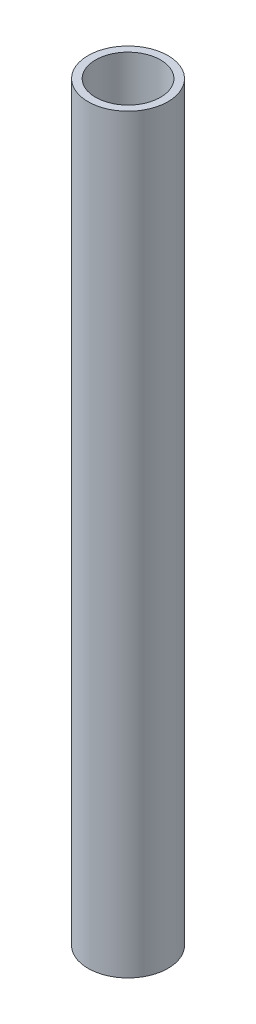
ISO-10303-21;
HEADER;
FILE_DESCRIPTION(('STEP AP214'),'2;1');
FILE_NAME('part.step','',(''),(''),'','','');
FILE_SCHEMA(('AUTOMOTIVE_DESIGN { 1 0 10303 214 1 1 1 1 }'));
ENDSEC;
DATA;
#1=APPLICATION_CONTEXT('core data for automotive mechanical design processes');
#2=APPLICATION_PROTOCOL_DEFINITION('international standard','automotive_design',2000,#1);
#3=PRODUCT_CONTEXT('',#1,'mechanical');
#4=PRODUCT('Part','Part','',(#3));
#5=PRODUCT_RELATED_PRODUCT_CATEGORY('part','',(#4));
#6=PRODUCT_DEFINITION_FORMATION('','',#4);
#7=PRODUCT_DEFINITION_CONTEXT('part definition',#1,'design');
#8=PRODUCT_DEFINITION('design','',#6,#7);
#9=PRODUCT_DEFINITION_SHAPE('','',#8);
#10=(LENGTH_UNIT() NAMED_UNIT(*) SI_UNIT(.MILLI.,.METRE.));
#11=(NAMED_UNIT(*) PLANE_ANGLE_UNIT() SI_UNIT($,.RADIAN.));
#12=(NAMED_UNIT(*) SI_UNIT($,.STERADIAN.) SOLID_ANGLE_UNIT());
#13=UNCERTAINTY_MEASURE_WITH_UNIT(LENGTH_MEASURE(1.E-05),#10,'distance_accuracy_value','');
#14=(GEOMETRIC_REPRESENTATION_CONTEXT(3) GLOBAL_UNCERTAINTY_ASSIGNED_CONTEXT((#13)) GLOBAL_UNIT_ASSIGNED_CONTEXT((#10,
#11,#12)) REPRESENTATION_CONTEXT('',''));
#15=CARTESIAN_POINT('',(0.,0.,0.));
#16=DIRECTION('',(0.,0.,1.));
#17=DIRECTION('',(1.,0.,0.));
#18=AXIS2_PLACEMENT_3D('',#15,#16,#17);
#19=CARTESIAN_POINT('',(2.44769482460327E-11,200.000000000001,1.5000000000002));
#20=DIRECTION('',(0.,1.,0.));
#21=DIRECTION('',(0.,0.,1.));
#22=AXIS2_PLACEMENT_3D('',#19,#20,#21);
#23=PLANE('',#22);
#24=CARTESIAN_POINT('',(2.44769482460327E-11,200.000000000001,1.5000000000002));
#25=DIRECTION('',(0.,1.,0.));
#26=DIRECTION('',(0.,0.,1.));
#27=AXIS2_PLACEMENT_3D('',#24,#25,#26);
#28=CIRCLE('',#27,10.65);
#29=CARTESIAN_POINT('',(2.44151500232522E-11,200.000000000001,-9.1499999999998));
#30=VERTEX_POINT('',#29);
#31=EDGE_CURVE('E12',#30,#30,#28,.T.);
#32=ORIENTED_EDGE('',*,*,#31,.T.);
#33=EDGE_LOOP('',(#32));
#34=FACE_BOUND('',#33,.T.);
#35=CARTESIAN_POINT('',(2.44769482460327E-11,200.000000000001,1.5000000000002));
#36=DIRECTION('',(0.,1.,0.));
#37=DIRECTION('',(0.,0.,1.));
#38=AXIS2_PLACEMENT_3D('',#35,#36,#37);
#39=CIRCLE('',#38,8.65);
#40=CARTESIAN_POINT('',(2.44267553233049E-11,200.000000000001,-7.1499999999998));
#41=VERTEX_POINT('',#40);
#42=EDGE_CURVE('E60',#41,#41,#39,.T.);
#43=ORIENTED_EDGE('',*,*,#42,.F.);
#44=EDGE_LOOP('',(#43));
#45=FACE_BOUND('',#44,.T.);
#46=ADVANCED_FACE('F46',(#34,#45),#23,.T.);
#47=CARTESIAN_POINT('',(2.45532760789757E-11,0.,1.5000000000005));
#48=DIRECTION('',(0.,1.,0.));
#49=DIRECTION('',(0.,0.,1.));
#50=AXIS2_PLACEMENT_3D('',#47,#48,#49);
#51=PLANE('',#50);
#52=CARTESIAN_POINT('',(2.45532760789757E-11,0.,1.5000000000005));
#53=DIRECTION('',(0.,1.,0.));
#54=DIRECTION('',(0.,0.,1.));
#55=AXIS2_PLACEMENT_3D('',#52,#53,#54);
#56=CIRCLE('',#55,10.65);
#57=CARTESIAN_POINT('',(2.4271393031569E-11,0.,-9.14999999999974));
#58=VERTEX_POINT('',#57);
#59=EDGE_CURVE('E50',#58,#58,#56,.T.);
#60=ORIENTED_EDGE('',*,*,#59,.F.);
#61=EDGE_LOOP('',(#60));
#62=FACE_BOUND('',#61,.T.);
#63=CARTESIAN_POINT('',(2.45532760789757E-11,0.,1.5000000000005));
#64=DIRECTION('',(0.,1.,0.));
#65=DIRECTION('',(0.,0.,1.));
#66=AXIS2_PLACEMENT_3D('',#63,#64,#65);
#67=CIRCLE('',#66,8.65);
#68=CARTESIAN_POINT('',(2.42829983316217E-11,0.,-7.14999999999975));
#69=VERTEX_POINT('',#68);
#70=EDGE_CURVE('E62',#69,#69,#67,.T.);
#71=ORIENTED_EDGE('',*,*,#70,.T.);
#72=EDGE_LOOP('',(#71));
#73=FACE_BOUND('',#72,.T.);
#74=ADVANCED_FACE('F75',(#62,#73),#51,.F.);
#75=CARTESIAN_POINT('',(2.44769482460327E-11,200.000000000001,1.5000000000002));
#76=DIRECTION('',(0.,-1.,0.));
#77=DIRECTION('',(0.,0.,-1.));
#78=AXIS2_PLACEMENT_3D('',#75,#76,#77);
#79=CYLINDRICAL_SURFACE('',#78,10.65);
#80=CARTESIAN_POINT('',(2.44151500232522E-11,200.000000000001,-9.1499999999998));
#81=CARTESIAN_POINT('',(2.44136525545888E-11,197.916666666667,-9.1499999999998));
#82=CARTESIAN_POINT('',(2.44121550859255E-11,195.833333333334,-9.1499999999998));
#83=CARTESIAN_POINT('',(2.44091601485987E-11,191.666666666667,-9.1499999999998));
#84=CARTESIAN_POINT('',(2.44076626799354E-11,189.583333333334,-9.1499999999998));
#85=CARTESIAN_POINT('',(2.44046677426086E-11,185.416666666667,-9.1499999999998));
#86=CARTESIAN_POINT('',(2.44031702739453E-11,183.333333333334,-9.1499999999998));
#87=CARTESIAN_POINT('',(2.44001753366185E-11,179.166666666667,-9.1499999999998));
#88=CARTESIAN_POINT('',(2.43986778679552E-11,177.083333333334,-9.14999999999979));
#89=CARTESIAN_POINT('',(2.43956829306284E-11,172.916666666667,-9.14999999999979));
#90=CARTESIAN_POINT('',(2.43941854619651E-11,170.833333333334,-9.14999999999979));
#91=CARTESIAN_POINT('',(2.43911905246383E-11,166.666666666667,-9.14999999999979));
#92=CARTESIAN_POINT('',(2.4389693055975E-11,164.583333333334,-9.14999999999979));
#93=CARTESIAN_POINT('',(2.43866981186482E-11,160.416666666667,-9.14999999999979));
#94=CARTESIAN_POINT('',(2.43852006499849E-11,158.333333333334,-9.14999999999979));
#95=CARTESIAN_POINT('',(2.43822057126581E-11,154.166666666667,-9.14999999999979));
#96=CARTESIAN_POINT('',(2.43807082439948E-11,152.083333333334,-9.14999999999979));
#97=CARTESIAN_POINT('',(2.4377713306668E-11,147.916666666667,-9.14999999999979));
#98=CARTESIAN_POINT('',(2.43762158380047E-11,145.833333333334,-9.14999999999979));
#99=CARTESIAN_POINT('',(2.43732209006779E-11,141.666666666667,-9.14999999999979));
#100=CARTESIAN_POINT('',(2.43717234320146E-11,139.583333333334,-9.14999999999978));
#101=CARTESIAN_POINT('',(2.43687284946878E-11,135.416666666667,-9.14999999999978));
#102=CARTESIAN_POINT('',(2.43672310260245E-11,133.333333333334,-9.14999999999978));
#103=CARTESIAN_POINT('',(2.43642360886977E-11,129.166666666667,-9.14999999999978));
#104=CARTESIAN_POINT('',(2.43627386200344E-11,127.083333333334,-9.14999999999978));
#105=CARTESIAN_POINT('',(2.43597436827076E-11,122.916666666667,-9.14999999999978));
#106=CARTESIAN_POINT('',(2.43582462140443E-11,120.833333333334,-9.14999999999978));
#107=CARTESIAN_POINT('',(2.43552512767175E-11,116.666666666667,-9.14999999999978));
#108=CARTESIAN_POINT('',(2.43537538080542E-11,114.583333333334,-9.14999999999978));
#109=CARTESIAN_POINT('',(2.43507588707274E-11,110.416666666667,-9.14999999999978));
#110=CARTESIAN_POINT('',(2.43492614020641E-11,108.333333333334,-9.14999999999977));
#111=CARTESIAN_POINT('',(2.43462664647373E-11,104.166666666667,-9.14999999999977));
#112=CARTESIAN_POINT('',(2.4344768996074E-11,102.083333333334,-9.14999999999977));
#113=CARTESIAN_POINT('',(2.43417740587472E-11,97.916666666667,-9.14999999999977));
#114=CARTESIAN_POINT('',(2.43402765900839E-11,95.8333333333336,-9.14999999999977));
#115=CARTESIAN_POINT('',(2.43372816527571E-11,91.666666666667,-9.14999999999977));
#116=CARTESIAN_POINT('',(2.43357841840938E-11,89.5833333333336,-9.14999999999977));
#117=CARTESIAN_POINT('',(2.4332789246767E-11,85.4166666666669,-9.14999999999977));
#118=CARTESIAN_POINT('',(2.43312917781037E-11,83.3333333333336,-9.14999999999977));
#119=CARTESIAN_POINT('',(2.43282968407769E-11,79.1666666666669,-9.14999999999977));
#120=CARTESIAN_POINT('',(2.43267993721136E-11,77.0833333333336,-9.14999999999977));
#121=CARTESIAN_POINT('',(2.43238044347868E-11,72.9166666666669,-9.14999999999977));
#122=CARTESIAN_POINT('',(2.43223069661235E-11,70.8333333333336,-9.14999999999976));
#123=CARTESIAN_POINT('',(2.43193120287967E-11,66.6666666666669,-9.14999999999976));
#124=CARTESIAN_POINT('',(2.43178145601334E-11,64.5833333333336,-9.14999999999976));
#125=CARTESIAN_POINT('',(2.43148196228066E-11,60.4166666666669,-9.14999999999976));
#126=CARTESIAN_POINT('',(2.43133221541433E-11,58.3333333333336,-9.14999999999976));
#127=CARTESIAN_POINT('',(2.43103272168165E-11,54.1666666666669,-9.14999999999976));
#128=CARTESIAN_POINT('',(2.43088297481532E-11,52.0833333333335,-9.14999999999976));
#129=CARTESIAN_POINT('',(2.43058348108264E-11,47.9166666666669,-9.14999999999976));
#130=CARTESIAN_POINT('',(2.43043373421631E-11,45.8333333333335,-9.14999999999976));
#131=CARTESIAN_POINT('',(2.43013424048363E-11,41.6666666666669,-9.14999999999976));
#132=CARTESIAN_POINT('',(2.4299844936173E-11,39.5833333333335,-9.14999999999976));
#133=CARTESIAN_POINT('',(2.42968499988462E-11,35.4166666666668,-9.14999999999976));
#134=CARTESIAN_POINT('',(2.42953525301829E-11,33.3333333333335,-9.14999999999975));
#135=CARTESIAN_POINT('',(2.42923575928561E-11,29.1666666666668,-9.14999999999975));
#136=CARTESIAN_POINT('',(2.42908601241928E-11,27.0833333333335,-9.14999999999975));
#137=CARTESIAN_POINT('',(2.4287865186866E-11,22.9166666666668,-9.14999999999975));
#138=CARTESIAN_POINT('',(2.42863677182027E-11,20.8333333333335,-9.14999999999975));
#139=CARTESIAN_POINT('',(2.42833727808759E-11,16.6666666666668,-9.14999999999975));
#140=CARTESIAN_POINT('',(2.42818753122126E-11,14.5833333333335,-9.14999999999975));
#141=CARTESIAN_POINT('',(2.42788803748858E-11,10.4166666666668,-9.14999999999975));
#142=CARTESIAN_POINT('',(2.42773829062225E-11,8.33333333333343,-9.14999999999975));
#143=CARTESIAN_POINT('',(2.42743879688957E-11,4.16666666666675,-9.14999999999975));
#144=CARTESIAN_POINT('',(2.42728905002324E-11,2.08333333333342,-9.14999999999974));
#145=CARTESIAN_POINT('',(2.4271393031569E-11,0.,-9.14999999999974));
#146=B_SPLINE_CURVE_WITH_KNOTS('',3,(#80,#81,#82,#83,#84,#85,#86,#87,#88,#89,#90,#91,#92,#93,
#94,#95,#96,#97,#98,#99,#100,#101,#102,#103,#104,#105,#106,#107,#108,#109,#110,#111,#112,#113,
#114,#115,#116,#117,#118,#119,#120,#121,#122,#123,#124,#125,#126,#127,#128,#129,#130,#131,#132,
#133,#134,#135,#136,#137,#138,#139,#140,#141,#142,#143,#144,#145),.UNSPECIFIED.,.F.,.F.,(4,2,2,
2,2,2,2,2,2,2,2,2,2,2,2,2,2,2,2,2,2,2,2,2,2,2,2,2,2,2,2,2,4),(0.,6.25000000000003,12.5,18.75,
25.0000000000001,31.2500000000001,37.5000000000001,43.7500000000001,50.0000000000001,
56.2500000000001,62.5000000000001,68.7500000000002,75.0000000000002,81.2500000000002,
87.5000000000002,93.7500000000002,100.,106.25,112.5,118.75,125.,131.25,137.5,143.75,150.,156.25,
162.5,168.75,175.,181.25,187.5,193.75,200.),.UNSPECIFIED.);
#147=EDGE_CURVE('BSEAM48',#30,#58,#146,.T.);
#148=ORIENTED_EDGE('',*,*,#31,.F.);
#149=ORIENTED_EDGE('',*,*,#59,.T.);
#150=ORIENTED_EDGE('',*,*,#147,.T.);
#151=ORIENTED_EDGE('',*,*,#147,.F.);
#152=EDGE_LOOP('',(#148,#150,#149,#151));
#153=FACE_BOUND('',#152,.T.);
#154=ADVANCED_FACE('F48',(#153),#79,.T.);
#155=CARTESIAN_POINT('',(2.44769482460327E-11,200.000000000001,1.5000000000002));
#156=DIRECTION('',(0.,-1.,0.));
#157=DIRECTION('',(0.,0.,-1.));
#158=AXIS2_PLACEMENT_3D('',#155,#156,#157);
#159=CYLINDRICAL_SURFACE('',#158,8.65);
#160=CARTESIAN_POINT('',(2.44267553233049E-11,200.000000000001,-7.1499999999998));
#161=CARTESIAN_POINT('',(2.44252578546415E-11,197.916666666667,-7.1499999999998));
#162=CARTESIAN_POINT('',(2.44237603859782E-11,195.833333333334,-7.1499999999998));
#163=CARTESIAN_POINT('',(2.44207654486514E-11,191.666666666667,-7.1499999999998));
#164=CARTESIAN_POINT('',(2.44192679799881E-11,189.583333333334,-7.1499999999998));
#165=CARTESIAN_POINT('',(2.44162730426613E-11,185.416666666667,-7.1499999999998));
#166=CARTESIAN_POINT('',(2.4414775573998E-11,183.333333333334,-7.1499999999998));
#167=CARTESIAN_POINT('',(2.44117806366712E-11,179.166666666667,-7.1499999999998));
#168=CARTESIAN_POINT('',(2.44102831680079E-11,177.083333333334,-7.1499999999998));
#169=CARTESIAN_POINT('',(2.44072882306811E-11,172.916666666667,-7.14999999999979));
#170=CARTESIAN_POINT('',(2.44057907620178E-11,170.833333333334,-7.14999999999979));
#171=CARTESIAN_POINT('',(2.4402795824691E-11,166.666666666667,-7.14999999999979));
#172=CARTESIAN_POINT('',(2.44012983560277E-11,164.583333333334,-7.14999999999979));
#173=CARTESIAN_POINT('',(2.43983034187009E-11,160.416666666667,-7.14999999999979));
#174=CARTESIAN_POINT('',(2.43968059500376E-11,158.333333333334,-7.14999999999979));
#175=CARTESIAN_POINT('',(2.43938110127108E-11,154.166666666667,-7.14999999999979));
#176=CARTESIAN_POINT('',(2.43923135440475E-11,152.083333333334,-7.14999999999979));
#177=CARTESIAN_POINT('',(2.43893186067207E-11,147.916666666667,-7.14999999999979));
#178=CARTESIAN_POINT('',(2.43878211380574E-11,145.833333333334,-7.14999999999979));
#179=CARTESIAN_POINT('',(2.43848262007306E-11,141.666666666667,-7.14999999999979));
#180=CARTESIAN_POINT('',(2.43833287320673E-11,139.583333333334,-7.14999999999979));
#181=CARTESIAN_POINT('',(2.43803337947405E-11,135.416666666667,-7.14999999999978));
#182=CARTESIAN_POINT('',(2.43788363260772E-11,133.333333333334,-7.14999999999978));
#183=CARTESIAN_POINT('',(2.43758413887504E-11,129.166666666667,-7.14999999999978));
#184=CARTESIAN_POINT('',(2.43743439200871E-11,127.083333333334,-7.14999999999978));
#185=CARTESIAN_POINT('',(2.43713489827603E-11,122.916666666667,-7.14999999999978));
#186=CARTESIAN_POINT('',(2.4369851514097E-11,120.833333333334,-7.14999999999978));
#187=CARTESIAN_POINT('',(2.43668565767702E-11,116.666666666667,-7.14999999999978));
#188=CARTESIAN_POINT('',(2.43653591081069E-11,114.583333333334,-7.14999999999978));
#189=CARTESIAN_POINT('',(2.43623641707801E-11,110.416666666667,-7.14999999999978));
#190=CARTESIAN_POINT('',(2.43608667021168E-11,108.333333333334,-7.14999999999978));
#191=CARTESIAN_POINT('',(2.435787176479E-11,104.166666666667,-7.14999999999978));
#192=CARTESIAN_POINT('',(2.43563742961267E-11,102.083333333334,-7.14999999999978));
#193=CARTESIAN_POINT('',(2.43533793587999E-11,97.916666666667,-7.14999999999977));
#194=CARTESIAN_POINT('',(2.43518818901366E-11,95.8333333333336,-7.14999999999977));
#195=CARTESIAN_POINT('',(2.43488869528098E-11,91.666666666667,-7.14999999999977));
#196=CARTESIAN_POINT('',(2.43473894841465E-11,89.5833333333336,-7.14999999999977));
#197=CARTESIAN_POINT('',(2.43443945468197E-11,85.4166666666669,-7.14999999999977));
#198=CARTESIAN_POINT('',(2.43428970781564E-11,83.3333333333336,-7.14999999999977));
#199=CARTESIAN_POINT('',(2.43399021408296E-11,79.1666666666669,-7.14999999999977));
#200=CARTESIAN_POINT('',(2.43384046721663E-11,77.0833333333336,-7.14999999999977));
#201=CARTESIAN_POINT('',(2.43354097348395E-11,72.9166666666669,-7.14999999999977));
#202=CARTESIAN_POINT('',(2.43339122661762E-11,70.8333333333336,-7.14999999999977));
#203=CARTESIAN_POINT('',(2.43309173288494E-11,66.6666666666669,-7.14999999999976));
#204=CARTESIAN_POINT('',(2.43294198601861E-11,64.5833333333336,-7.14999999999976));
#205=CARTESIAN_POINT('',(2.43264249228593E-11,60.4166666666669,-7.14999999999976));
#206=CARTESIAN_POINT('',(2.4324927454196E-11,58.3333333333336,-7.14999999999976));
#207=CARTESIAN_POINT('',(2.43219325168692E-11,54.1666666666669,-7.14999999999976));
#208=CARTESIAN_POINT('',(2.43204350482059E-11,52.0833333333335,-7.14999999999976));
#209=CARTESIAN_POINT('',(2.43174401108791E-11,47.9166666666669,-7.14999999999976));
#210=CARTESIAN_POINT('',(2.43159426422158E-11,45.8333333333335,-7.14999999999976));
#211=CARTESIAN_POINT('',(2.4312947704889E-11,41.6666666666669,-7.14999999999976));
#212=CARTESIAN_POINT('',(2.43114502362257E-11,39.5833333333335,-7.14999999999976));
#213=CARTESIAN_POINT('',(2.43084552988989E-11,35.4166666666668,-7.14999999999976));
#214=CARTESIAN_POINT('',(2.43069578302356E-11,33.3333333333335,-7.14999999999976));
#215=CARTESIAN_POINT('',(2.43039628929088E-11,29.1666666666668,-7.14999999999975));
#216=CARTESIAN_POINT('',(2.43024654242455E-11,27.0833333333335,-7.14999999999975));
#217=CARTESIAN_POINT('',(2.42994704869187E-11,22.9166666666668,-7.14999999999975));
#218=CARTESIAN_POINT('',(2.42979730182554E-11,20.8333333333335,-7.14999999999975));
#219=CARTESIAN_POINT('',(2.42949780809286E-11,16.6666666666668,-7.14999999999975));
#220=CARTESIAN_POINT('',(2.42934806122653E-11,14.5833333333335,-7.14999999999975));
#221=CARTESIAN_POINT('',(2.42904856749385E-11,10.4166666666668,-7.14999999999975));
#222=CARTESIAN_POINT('',(2.42889882062752E-11,8.33333333333343,-7.14999999999975));
#223=CARTESIAN_POINT('',(2.42859932689484E-11,4.16666666666675,-7.14999999999975));
#224=CARTESIAN_POINT('',(2.42844958002851E-11,2.08333333333342,-7.14999999999975));
#225=CARTESIAN_POINT('',(2.42829983316217E-11,0.,-7.14999999999975));
#226=B_SPLINE_CURVE_WITH_KNOTS('',3,(#160,#161,#162,#163,#164,#165,#166,#167,#168,#169,#170,
#171,#172,#173,#174,#175,#176,#177,#178,#179,#180,#181,#182,#183,#184,#185,#186,#187,#188,#189,
#190,#191,#192,#193,#194,#195,#196,#197,#198,#199,#200,#201,#202,#203,#204,#205,#206,#207,#208,
#209,#210,#211,#212,#213,#214,#215,#216,#217,#218,#219,#220,#221,#222,#223,#224,#225),
.UNSPECIFIED.,.F.,.F.,(4,2,2,2,2,2,2,2,2,2,2,2,2,2,2,2,2,2,2,2,2,2,2,2,2,2,2,2,2,2,2,2,4),(0.,
6.25000000000003,12.5,18.75,25.0000000000001,31.2500000000001,37.5000000000001,43.7500000000001,
50.0000000000001,56.2500000000001,62.5000000000001,68.7500000000002,75.0000000000002,
81.2500000000002,87.5000000000002,93.7500000000002,100.,106.25,112.5,118.75,125.,131.25,137.5,
143.75,150.,156.25,162.5,168.75,175.,181.25,187.5,193.75,200.),.UNSPECIFIED.);
#227=EDGE_CURVE('BSEAM71',#41,#69,#226,.T.);
#228=ORIENTED_EDGE('',*,*,#42,.T.);
#229=ORIENTED_EDGE('',*,*,#70,.F.);
#230=ORIENTED_EDGE('',*,*,#227,.T.);
#231=ORIENTED_EDGE('',*,*,#227,.F.);
#232=EDGE_LOOP('',(#228,#230,#229,#231));
#233=FACE_BOUND('',#232,.T.);
#234=ADVANCED_FACE('F71',(#233),#159,.F.);
#235=CLOSED_SHELL('',(#46,#74,#154,#234));
#236=MANIFOLD_SOLID_BREP('B2',#235);
#237=ADVANCED_BREP_SHAPE_REPRESENTATION('',(#18,#236),#14);
#238=SHAPE_DEFINITION_REPRESENTATION(#9,#237);
ENDSEC;
END-ISO-10303-21;
